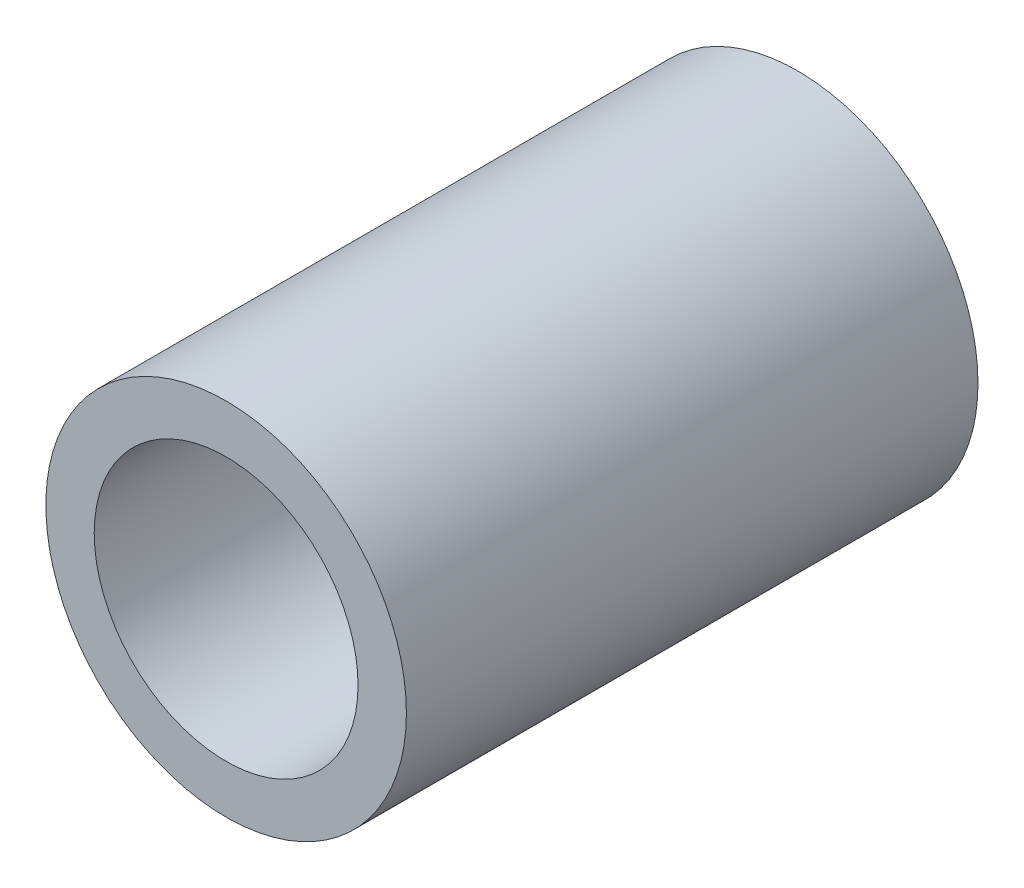
ISO-10303-21;
HEADER;
FILE_DESCRIPTION(('STEP AP214'),'2;1');
FILE_NAME('part.step','',(''),(''),'','','');
FILE_SCHEMA(('AUTOMOTIVE_DESIGN { 1 0 10303 214 1 1 1 1 }'));
ENDSEC;
DATA;
#1=APPLICATION_CONTEXT('core data for automotive mechanical design processes');
#2=APPLICATION_PROTOCOL_DEFINITION('international standard','automotive_design',2000,#1);
#3=PRODUCT_CONTEXT('',#1,'mechanical');
#4=PRODUCT('Part','Part','',(#3));
#5=PRODUCT_RELATED_PRODUCT_CATEGORY('part','',(#4));
#6=PRODUCT_DEFINITION_FORMATION('','',#4);
#7=PRODUCT_DEFINITION_CONTEXT('part definition',#1,'design');
#8=PRODUCT_DEFINITION('design','',#6,#7);
#9=PRODUCT_DEFINITION_SHAPE('','',#8);
#10=(LENGTH_UNIT() NAMED_UNIT(*) SI_UNIT(.MILLI.,.METRE.));
#11=(NAMED_UNIT(*) PLANE_ANGLE_UNIT() SI_UNIT($,.RADIAN.));
#12=(NAMED_UNIT(*) SI_UNIT($,.STERADIAN.) SOLID_ANGLE_UNIT());
#13=UNCERTAINTY_MEASURE_WITH_UNIT(LENGTH_MEASURE(1.E-05),#10,'distance_accuracy_value','');
#14=(GEOMETRIC_REPRESENTATION_CONTEXT(3) GLOBAL_UNCERTAINTY_ASSIGNED_CONTEXT((#13)) GLOBAL_UNIT_ASSIGNED_CONTEXT((#10,
#11,#12)) REPRESENTATION_CONTEXT('',''));
#15=CARTESIAN_POINT('',(0.,0.,0.));
#16=DIRECTION('',(0.,0.,1.));
#17=DIRECTION('',(1.,0.,0.));
#18=AXIS2_PLACEMENT_3D('',#15,#16,#17);
#19=CARTESIAN_POINT('',(0.,0.,130.));
#20=DIRECTION('',(0.,0.,-1.));
#21=DIRECTION('',(-1.,0.,0.));
#22=AXIS2_PLACEMENT_3D('',#19,#20,#21);
#23=CYLINDRICAL_SURFACE('',#22,41.);
#24=CARTESIAN_POINT('',(0.,0.,130.));
#25=DIRECTION('',(0.,0.,1.));
#26=DIRECTION('',(1.,0.,0.));
#27=AXIS2_PLACEMENT_3D('',#24,#25,#26);
#28=CIRCLE('',#27,41.);
#29=CARTESIAN_POINT('',(41.,0.,130.));
#30=VERTEX_POINT('',#29);
#31=EDGE_CURVE('E10',#30,#30,#28,.T.);
#32=ORIENTED_EDGE('',*,*,#31,.F.);
#33=EDGE_LOOP('',(#32));
#34=FACE_BOUND('',#33,.T.);
#35=CARTESIAN_POINT('',(0.,0.,0.));
#36=DIRECTION('',(0.,0.,1.));
#37=DIRECTION('',(1.,0.,0.));
#38=AXIS2_PLACEMENT_3D('',#35,#36,#37);
#39=CIRCLE('',#38,41.);
#40=CARTESIAN_POINT('',(41.,0.,0.));
#41=VERTEX_POINT('',#40);
#42=EDGE_CURVE('E45',#41,#41,#39,.T.);
#43=ORIENTED_EDGE('',*,*,#42,.T.);
#44=EDGE_LOOP('',(#43));
#45=FACE_BOUND('',#44,.T.);
#46=ADVANCED_FACE('F37',(#34,#45),#23,.T.);
#47=CARTESIAN_POINT('',(0.,0.,130.));
#48=DIRECTION('',(0.,0.,1.));
#49=DIRECTION('',(1.,0.,0.));
#50=AXIS2_PLACEMENT_3D('',#47,#48,#49);
#51=PLANE('',#50);
#52=CARTESIAN_POINT('',(0.,0.,130.));
#53=DIRECTION('',(0.,0.,1.));
#54=DIRECTION('',(1.,0.,0.));
#55=AXIS2_PLACEMENT_3D('',#52,#53,#54);
#56=CIRCLE('',#55,30.);
#57=CARTESIAN_POINT('',(30.,0.,130.));
#58=VERTEX_POINT('',#57);
#59=EDGE_CURVE('E52',#58,#58,#56,.T.);
#60=ORIENTED_EDGE('',*,*,#59,.F.);
#61=EDGE_LOOP('',(#60));
#62=FACE_BOUND('',#61,.T.);
#63=ORIENTED_EDGE('',*,*,#31,.T.);
#64=EDGE_LOOP('',(#63));
#65=FACE_BOUND('',#64,.T.);
#66=ADVANCED_FACE('F70',(#62,#65),#51,.T.);
#67=CARTESIAN_POINT('',(0.,0.,0.));
#68=DIRECTION('',(0.,0.,1.));
#69=DIRECTION('',(1.,0.,0.));
#70=AXIS2_PLACEMENT_3D('',#67,#68,#69);
#71=PLANE('',#70);
#72=CARTESIAN_POINT('',(0.,0.,0.));
#73=DIRECTION('',(0.,0.,1.));
#74=DIRECTION('',(1.,0.,0.));
#75=AXIS2_PLACEMENT_3D('',#72,#73,#74);
#76=CIRCLE('',#75,30.);
#77=CARTESIAN_POINT('',(30.,0.,0.));
#78=VERTEX_POINT('',#77);
#79=EDGE_CURVE('E40',#78,#78,#76,.T.);
#80=ORIENTED_EDGE('',*,*,#79,.T.);
#81=EDGE_LOOP('',(#80));
#82=FACE_BOUND('',#81,.T.);
#83=ORIENTED_EDGE('',*,*,#42,.F.);
#84=EDGE_LOOP('',(#83));
#85=FACE_BOUND('',#84,.T.);
#86=ADVANCED_FACE('F61',(#82,#85),#71,.F.);
#87=CARTESIAN_POINT('',(0.,0.,-10.));
#88=DIRECTION('',(0.,0.,1.));
#89=DIRECTION('',(1.,0.,0.));
#90=AXIS2_PLACEMENT_3D('',#87,#88,#89);
#91=CYLINDRICAL_SURFACE('',#90,30.);
#92=ORIENTED_EDGE('',*,*,#59,.T.);
#93=EDGE_LOOP('',(#92));
#94=FACE_BOUND('',#93,.T.);
#95=ORIENTED_EDGE('',*,*,#79,.F.);
#96=EDGE_LOOP('',(#95));
#97=FACE_BOUND('',#96,.T.);
#98=ADVANCED_FACE('F64',(#94,#97),#91,.F.);
#99=CLOSED_SHELL('',(#46,#66,#86,#98));
#100=MANIFOLD_SOLID_BREP('B2',#99);
#101=ADVANCED_BREP_SHAPE_REPRESENTATION('',(#18,#100),#14);
#102=SHAPE_DEFINITION_REPRESENTATION(#9,#101);
ENDSEC;
END-ISO-10303-21;
